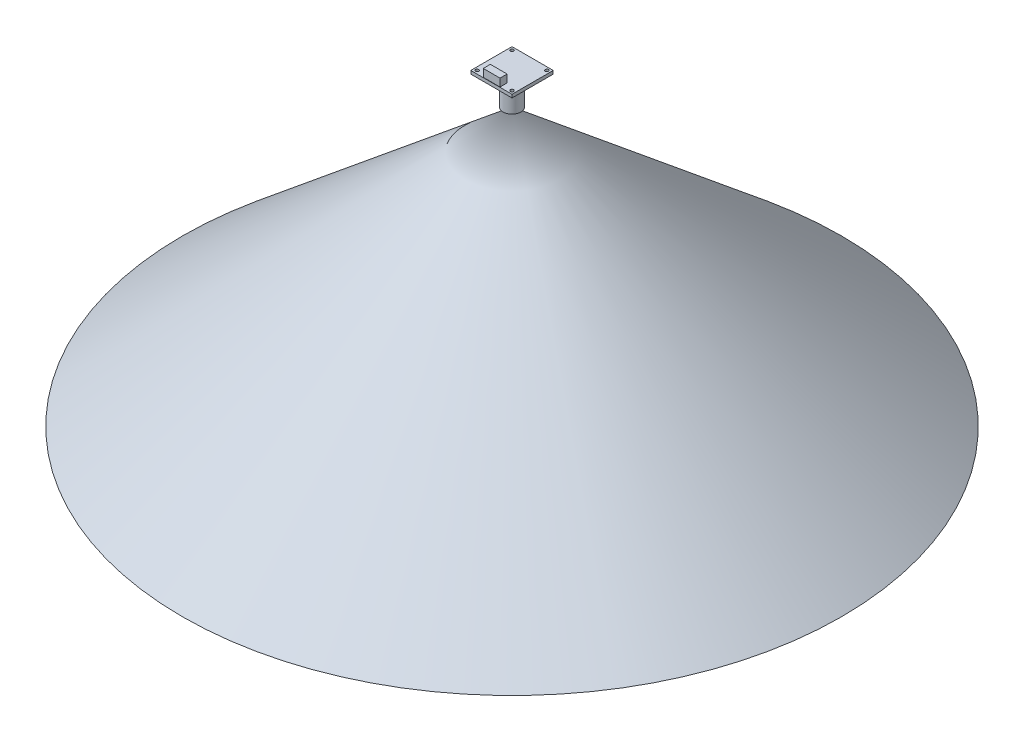
ISO-10303-21;
HEADER;
FILE_DESCRIPTION(('STEP AP214'),'2;1');
FILE_NAME('part.step','',(''),(''),'','','');
FILE_SCHEMA(('AUTOMOTIVE_DESIGN { 1 0 10303 214 1 1 1 1 }'));
ENDSEC;
DATA;
#1=APPLICATION_CONTEXT('core data for automotive mechanical design processes');
#2=APPLICATION_PROTOCOL_DEFINITION('international standard','automotive_design',2000,#1);
#3=PRODUCT_CONTEXT('',#1,'mechanical');
#4=PRODUCT('Part','Part','',(#3));
#5=PRODUCT_RELATED_PRODUCT_CATEGORY('part','',(#4));
#6=PRODUCT_DEFINITION_FORMATION('','',#4);
#7=PRODUCT_DEFINITION_CONTEXT('part definition',#1,'design');
#8=PRODUCT_DEFINITION('design','',#6,#7);
#9=PRODUCT_DEFINITION_SHAPE('','',#8);
#10=(LENGTH_UNIT() NAMED_UNIT(*) SI_UNIT(.MILLI.,.METRE.));
#11=(NAMED_UNIT(*) PLANE_ANGLE_UNIT() SI_UNIT($,.RADIAN.));
#12=(NAMED_UNIT(*) SI_UNIT($,.STERADIAN.) SOLID_ANGLE_UNIT());
#13=UNCERTAINTY_MEASURE_WITH_UNIT(LENGTH_MEASURE(1.E-05),#10,'distance_accuracy_value','');
#14=(GEOMETRIC_REPRESENTATION_CONTEXT(3) GLOBAL_UNCERTAINTY_ASSIGNED_CONTEXT((#13)) GLOBAL_UNIT_ASSIGNED_CONTEXT((#10,
#11,#12)) REPRESENTATION_CONTEXT('',''));
#15=CARTESIAN_POINT('',(0.,0.,0.));
#16=DIRECTION('',(0.,0.,1.));
#17=DIRECTION('',(1.,0.,0.));
#18=AXIS2_PLACEMENT_3D('',#15,#16,#17);
#19=CARTESIAN_POINT('',(0.,-236.641949206085,0.));
#20=DIRECTION('',(0.,1.,0.));
#21=DIRECTION('',(0.,0.,1.));
#22=AXIS2_PLACEMENT_3D('',#19,#20,#21);
#23=PLANE('',#22);
#24=CARTESIAN_POINT('',(0.,-236.641949206085,0.));
#25=DIRECTION('',(0.,1.,0.));
#26=DIRECTION('',(0.,0.,1.));
#27=AXIS2_PLACEMENT_3D('',#24,#25,#26);
#28=CIRCLE('',#27,255.800314087776);
#29=CARTESIAN_POINT('',(0.,-236.641949206085,255.800314087776));
#30=VERTEX_POINT('',#29);
#31=EDGE_CURVE('E12',#30,#30,#28,.T.);
#32=ORIENTED_EDGE('',*,*,#31,.F.);
#33=EDGE_LOOP('',(#32));
#34=FACE_BOUND('',#33,.T.);
#35=ADVANCED_FACE('F49',(#34),#23,.F.);
#36=CARTESIAN_POINT('',(0.,-236.641949206085,0.));
#37=DIRECTION('',(0.,-1.,0.));
#38=DIRECTION('',(0.,0.,-1.));
#39=AXIS2_PLACEMENT_3D('',#36,#37,#38);
#40=CONICAL_SURFACE('',#39,255.800314087776,0.872664625997167);
#41=CARTESIAN_POINT('',(0.,-22.,0.));
#42=VERTEX_POINT('',#41);
#43=VERTEX_LOOP('',#42);
#44=FACE_BOUND('',#43,.T.);
#45=ORIENTED_EDGE('',*,*,#31,.T.);
#46=EDGE_LOOP('',(#45));
#47=FACE_BOUND('',#46,.T.);
#48=ADVANCED_FACE('F56',(#44,#47),#40,.T.);
#49=CLOSED_SHELL('',(#35,#48));
#50=MANIFOLD_SOLID_BREP('B2_NOT_SHOWN',#49);
#51=CARTESIAN_POINT('',(0.,-22.,0.));
#52=DIRECTION('',(0.,1.,0.));
#53=DIRECTION('',(0.,0.,1.));
#54=AXIS2_PLACEMENT_3D('',#51,#52,#53);
#55=CYLINDRICAL_SURFACE('',#54,6.9);
#56=CARTESIAN_POINT('',(0.,-22.,0.));
#57=DIRECTION('',(0.,-1.,0.));
#58=DIRECTION('',(0.,0.,-1.));
#59=AXIS2_PLACEMENT_3D('',#56,#57,#58);
#60=CIRCLE('',#59,6.9);
#61=CARTESIAN_POINT('',(0.,-22.,-6.9));
#62=VERTEX_POINT('',#61);
#63=EDGE_CURVE('E48',#62,#62,#60,.T.);
#64=ORIENTED_EDGE('',*,*,#63,.F.);
#65=EDGE_LOOP('',(#64));
#66=FACE_BOUND('',#65,.T.);
#67=CARTESIAN_POINT('',(0.,0.,0.));
#68=DIRECTION('',(0.,-1.,0.));
#69=DIRECTION('',(0.,0.,-1.));
#70=AXIS2_PLACEMENT_3D('',#67,#68,#69);
#71=CIRCLE('',#70,6.9);
#72=CARTESIAN_POINT('',(0.,0.,-6.9));
#73=VERTEX_POINT('',#72);
#74=EDGE_CURVE('E89',#73,#73,#71,.T.);
#75=ORIENTED_EDGE('',*,*,#74,.T.);
#76=EDGE_LOOP('',(#75));
#77=FACE_BOUND('',#76,.T.);
#78=ADVANCED_FACE('F86',(#66,#77),#55,.T.);
#79=CARTESIAN_POINT('',(0.,-22.,0.));
#80=DIRECTION('',(0.,-1.,0.));
#81=DIRECTION('',(0.,0.,-1.));
#82=AXIS2_PLACEMENT_3D('',#79,#80,#81);
#83=PLANE('',#82);
#84=ORIENTED_EDGE('',*,*,#63,.T.);
#85=EDGE_LOOP('',(#84));
#86=FACE_BOUND('',#85,.T.);
#87=ADVANCED_FACE('F101',(#86),#83,.T.);
#88=CARTESIAN_POINT('',(0.,0.,0.));
#89=DIRECTION('',(0.,-1.,0.));
#90=DIRECTION('',(0.,0.,-1.));
#91=AXIS2_PLACEMENT_3D('',#88,#89,#90);
#92=PLANE('',#91);
#93=ORIENTED_EDGE('',*,*,#74,.F.);
#94=EDGE_LOOP('',(#93));
#95=FACE_BOUND('',#94,.T.);
#96=ADVANCED_FACE('F99',(#95),#92,.F.);
#97=CLOSED_SHELL('',(#78,#87,#96));
#98=MANIFOLD_SOLID_BREP('B6',#97);
#99=CARTESIAN_POINT('',(6.50000000000001,8.5,15.8));
#100=DIRECTION('',(-1.,0.,0.));
#101=DIRECTION('',(0.,0.,1.));
#102=AXIS2_PLACEMENT_3D('',#99,#100,#101);
#103=PLANE('',#102);
#104=DIRECTION('',(0.,0.,-1.));
#105=VECTOR('',#104,1.);
#106=CARTESIAN_POINT('',(6.50000000000001,2.5,15.8));
#107=LINE('',#106,#105);
#108=CARTESIAN_POINT('',(6.50000000000001,2.5,15.8));
#109=VERTEX_POINT('',#108);
#110=CARTESIAN_POINT('',(6.50000000000001,2.5,10.3));
#111=VERTEX_POINT('',#110);
#112=EDGE_CURVE('E198',#109,#111,#107,.T.);
#113=ORIENTED_EDGE('',*,*,#112,.T.);
#114=DIRECTION('',(0.,-1.,0.));
#115=VECTOR('',#114,1.);
#116=CARTESIAN_POINT('',(6.50000000000001,8.5,10.3));
#117=LINE('',#116,#115);
#118=CARTESIAN_POINT('',(6.50000000000001,8.5,10.3));
#119=VERTEX_POINT('',#118);
#120=EDGE_CURVE('E84',#119,#111,#117,.T.);
#121=ORIENTED_EDGE('',*,*,#120,.F.);
#122=DIRECTION('',(0.,0.,-1.));
#123=VECTOR('',#122,1.);
#124=CARTESIAN_POINT('',(6.50000000000001,8.5,15.8));
#125=LINE('',#124,#123);
#126=CARTESIAN_POINT('',(6.50000000000001,8.5,15.8));
#127=VERTEX_POINT('',#126);
#128=EDGE_CURVE('E186',#127,#119,#125,.T.);
#129=ORIENTED_EDGE('',*,*,#128,.F.);
#130=DIRECTION('',(0.,-1.,0.));
#131=VECTOR('',#130,1.);
#132=CARTESIAN_POINT('',(6.50000000000001,8.5,15.8));
#133=LINE('',#132,#131);
#134=EDGE_CURVE('E194',#127,#109,#133,.T.);
#135=ORIENTED_EDGE('',*,*,#134,.T.);
#136=EDGE_LOOP('',(#113,#121,#129,#135));
#137=FACE_BOUND('',#136,.T.);
#138=ADVANCED_FACE('F135',(#137),#103,.F.);
#139=CARTESIAN_POINT('',(-6.49999999999999,8.5,10.3));
#140=DIRECTION('',(0.,0.,1.));
#141=DIRECTION('',(1.,0.,0.));
#142=AXIS2_PLACEMENT_3D('',#139,#140,#141);
#143=PLANE('',#142);
#144=DIRECTION('',(-1.,0.,0.));
#145=VECTOR('',#144,1.);
#146=CARTESIAN_POINT('',(-6.49999999999999,2.5,10.3));
#147=LINE('',#146,#145);
#148=CARTESIAN_POINT('',(-6.49999999999999,2.5,10.3));
#149=VERTEX_POINT('',#148);
#150=EDGE_CURVE('E190',#111,#149,#147,.T.);
#151=ORIENTED_EDGE('',*,*,#150,.T.);
#152=DIRECTION('',(0.,-1.,0.));
#153=VECTOR('',#152,1.);
#154=CARTESIAN_POINT('',(-6.49999999999999,8.5,10.3));
#155=LINE('',#154,#153);
#156=CARTESIAN_POINT('',(-6.49999999999999,8.5,10.3));
#157=VERTEX_POINT('',#156);
#158=EDGE_CURVE('E143',#157,#149,#155,.T.);
#159=ORIENTED_EDGE('',*,*,#158,.F.);
#160=DIRECTION('',(-1.,0.,0.));
#161=VECTOR('',#160,1.);
#162=CARTESIAN_POINT('',(-6.49999999999999,8.5,10.3));
#163=LINE('',#162,#161);
#164=EDGE_CURVE('E181',#119,#157,#163,.T.);
#165=ORIENTED_EDGE('',*,*,#164,.F.);
#166=ORIENTED_EDGE('',*,*,#120,.T.);
#167=EDGE_LOOP('',(#151,#159,#165,#166));
#168=FACE_BOUND('',#167,.T.);
#169=ADVANCED_FACE('F189',(#168),#143,.F.);
#170=CARTESIAN_POINT('',(-6.49999999999999,8.5,15.8));
#171=DIRECTION('',(1.,0.,0.));
#172=DIRECTION('',(0.,0.,-1.));
#173=AXIS2_PLACEMENT_3D('',#170,#171,#172);
#174=PLANE('',#173);
#175=DIRECTION('',(0.,0.,1.));
#176=VECTOR('',#175,1.);
#177=CARTESIAN_POINT('',(-6.49999999999999,2.5,15.8));
#178=LINE('',#177,#176);
#179=CARTESIAN_POINT('',(-6.49999999999999,2.5,15.8));
#180=VERTEX_POINT('',#179);
#181=EDGE_CURVE('E168',#149,#180,#178,.T.);
#182=ORIENTED_EDGE('',*,*,#181,.T.);
#183=DIRECTION('',(0.,-1.,0.));
#184=VECTOR('',#183,1.);
#185=CARTESIAN_POINT('',(-6.49999999999999,8.5,15.8));
#186=LINE('',#185,#184);
#187=CARTESIAN_POINT('',(-6.49999999999999,8.5,15.8));
#188=VERTEX_POINT('',#187);
#189=EDGE_CURVE('E191',#188,#180,#186,.T.);
#190=ORIENTED_EDGE('',*,*,#189,.F.);
#191=DIRECTION('',(0.,0.,1.));
#192=VECTOR('',#191,1.);
#193=CARTESIAN_POINT('',(-6.49999999999999,8.5,15.8));
#194=LINE('',#193,#192);
#195=EDGE_CURVE('E184',#157,#188,#194,.T.);
#196=ORIENTED_EDGE('',*,*,#195,.F.);
#197=ORIENTED_EDGE('',*,*,#158,.T.);
#198=EDGE_LOOP('',(#182,#190,#196,#197));
#199=FACE_BOUND('',#198,.T.);
#200=ADVANCED_FACE('F192',(#199),#174,.F.);
#201=CARTESIAN_POINT('',(-6.49999999999999,8.5,15.8));
#202=DIRECTION('',(0.,0.,-1.));
#203=DIRECTION('',(-1.,0.,0.));
#204=AXIS2_PLACEMENT_3D('',#201,#202,#203);
#205=PLANE('',#204);
#206=DIRECTION('',(1.,0.,0.));
#207=VECTOR('',#206,1.);
#208=CARTESIAN_POINT('',(-6.49999999999999,2.5,15.8));
#209=LINE('',#208,#207);
#210=EDGE_CURVE('E174',#180,#109,#209,.T.);
#211=ORIENTED_EDGE('',*,*,#210,.T.);
#212=ORIENTED_EDGE('',*,*,#134,.F.);
#213=DIRECTION('',(1.,0.,0.));
#214=VECTOR('',#213,1.);
#215=CARTESIAN_POINT('',(-6.49999999999999,8.5,15.8));
#216=LINE('',#215,#214);
#217=EDGE_CURVE('E151',#188,#127,#216,.T.);
#218=ORIENTED_EDGE('',*,*,#217,.F.);
#219=ORIENTED_EDGE('',*,*,#189,.T.);
#220=EDGE_LOOP('',(#211,#212,#218,#219));
#221=FACE_BOUND('',#220,.T.);
#222=ADVANCED_FACE('F205',(#221),#205,.F.);
#223=CARTESIAN_POINT('',(0.,8.5,0.));
#224=DIRECTION('',(0.,-1.,0.));
#225=DIRECTION('',(0.,0.,-1.));
#226=AXIS2_PLACEMENT_3D('',#223,#224,#225);
#227=PLANE('',#226);
#228=ORIENTED_EDGE('',*,*,#128,.T.);
#229=ORIENTED_EDGE('',*,*,#164,.T.);
#230=ORIENTED_EDGE('',*,*,#195,.T.);
#231=ORIENTED_EDGE('',*,*,#217,.T.);
#232=EDGE_LOOP('',(#228,#229,#230,#231));
#233=FACE_BOUND('',#232,.T.);
#234=ADVANCED_FACE('F182',(#233),#227,.F.);
#235=CARTESIAN_POINT('',(0.,2.5,0.));
#236=DIRECTION('',(0.,-1.,0.));
#237=DIRECTION('',(0.,0.,-1.));
#238=AXIS2_PLACEMENT_3D('',#235,#236,#237);
#239=PLANE('',#238);
#240=ORIENTED_EDGE('',*,*,#112,.F.);
#241=ORIENTED_EDGE('',*,*,#210,.F.);
#242=ORIENTED_EDGE('',*,*,#181,.F.);
#243=ORIENTED_EDGE('',*,*,#150,.F.);
#244=EDGE_LOOP('',(#240,#241,#242,#243));
#245=FACE_BOUND('',#244,.T.);
#246=ADVANCED_FACE('F208',(#245),#239,.T.);
#247=CLOSED_SHELL('',(#138,#169,#200,#222,#234,#246));
#248=MANIFOLD_SOLID_BREP('B43',#247);
#249=CARTESIAN_POINT('',(0.,2.5,0.));
#250=DIRECTION('',(0.,1.,0.));
#251=DIRECTION('',(0.,0.,1.));
#252=AXIS2_PLACEMENT_3D('',#249,#250,#251);
#253=PLANE('',#252);
#254=CARTESIAN_POINT('',(13.5,2.5,13.5));
#255=DIRECTION('',(0.,1.,0.));
#256=DIRECTION('',(0.,0.,1.));
#257=AXIS2_PLACEMENT_3D('',#254,#255,#256);
#258=CIRCLE('',#257,1.25);
#259=CARTESIAN_POINT('',(13.5,2.5,14.75));
#260=VERTEX_POINT('',#259);
#261=EDGE_CURVE('E346',#260,#260,#258,.T.);
#262=ORIENTED_EDGE('',*,*,#261,.F.);
#263=EDGE_LOOP('',(#262));
#264=FACE_BOUND('',#263,.T.);
#265=CARTESIAN_POINT('',(-13.5,2.5,-13.5));
#266=DIRECTION('',(0.,1.,0.));
#267=DIRECTION('',(0.,0.,1.));
#268=AXIS2_PLACEMENT_3D('',#265,#266,#267);
#269=CIRCLE('',#268,1.25);
#270=CARTESIAN_POINT('',(-13.5,2.5,-12.25));
#271=VERTEX_POINT('',#270);
#272=EDGE_CURVE('E325',#271,#271,#269,.T.);
#273=ORIENTED_EDGE('',*,*,#272,.F.);
#274=EDGE_LOOP('',(#273));
#275=FACE_BOUND('',#274,.T.);
#276=DIRECTION('',(0.,0.,-1.));
#277=VECTOR('',#276,1.);
#278=CARTESIAN_POINT('',(16.,2.5,-16.));
#279=LINE('',#278,#277);
#280=CARTESIAN_POINT('',(16.,2.5,16.));
#281=VERTEX_POINT('',#280);
#282=CARTESIAN_POINT('',(16.,2.5,-16.));
#283=VERTEX_POINT('',#282);
#284=EDGE_CURVE('E310',#281,#283,#279,.T.);
#285=ORIENTED_EDGE('',*,*,#284,.T.);
#286=DIRECTION('',(-1.,0.,0.));
#287=VECTOR('',#286,1.);
#288=CARTESIAN_POINT('',(-16.,2.5,-16.));
#289=LINE('',#288,#287);
#290=CARTESIAN_POINT('',(-16.,2.5,-16.));
#291=VERTEX_POINT('',#290);
#292=EDGE_CURVE('E305',#283,#291,#289,.T.);
#293=ORIENTED_EDGE('',*,*,#292,.T.);
#294=DIRECTION('',(0.,0.,1.));
#295=VECTOR('',#294,1.);
#296=CARTESIAN_POINT('',(-16.,2.5,-16.));
#297=LINE('',#296,#295);
#298=CARTESIAN_POINT('',(-16.,2.5,16.));
#299=VERTEX_POINT('',#298);
#300=EDGE_CURVE('E308',#291,#299,#297,.T.);
#301=ORIENTED_EDGE('',*,*,#300,.T.);
#302=DIRECTION('',(1.,0.,0.));
#303=VECTOR('',#302,1.);
#304=CARTESIAN_POINT('',(-16.,2.5,16.));
#305=LINE('',#304,#303);
#306=EDGE_CURVE('E275',#299,#281,#305,.T.);
#307=ORIENTED_EDGE('',*,*,#306,.T.);
#308=EDGE_LOOP('',(#285,#293,#301,#307));
#309=FACE_BOUND('',#308,.T.);
#310=CARTESIAN_POINT('',(13.5,2.5,-13.5));
#311=DIRECTION('',(0.,1.,0.));
#312=DIRECTION('',(0.,0.,-1.));
#313=AXIS2_PLACEMENT_3D('',#310,#311,#312);
#314=CIRCLE('',#313,1.25);
#315=CARTESIAN_POINT('',(13.5,2.5,-14.75));
#316=VERTEX_POINT('',#315);
#317=EDGE_CURVE('E340',#316,#316,#314,.T.);
#318=ORIENTED_EDGE('',*,*,#317,.F.);
#319=EDGE_LOOP('',(#318));
#320=FACE_BOUND('',#319,.T.);
#321=CARTESIAN_POINT('',(-13.5,2.5,13.5));
#322=DIRECTION('',(0.,1.,0.));
#323=DIRECTION('',(0.,0.,-1.));
#324=AXIS2_PLACEMENT_3D('',#321,#322,#323);
#325=CIRCLE('',#324,1.25);
#326=CARTESIAN_POINT('',(-13.5,2.5,12.25));
#327=VERTEX_POINT('',#326);
#328=EDGE_CURVE('E352',#327,#327,#325,.T.);
#329=ORIENTED_EDGE('',*,*,#328,.F.);
#330=EDGE_LOOP('',(#329));
#331=FACE_BOUND('',#330,.T.);
#332=ADVANCED_FACE('F258',(#264,#275,#309,#320,#331),#253,.T.);
#333=CARTESIAN_POINT('',(0.,0.,0.));
#334=DIRECTION('',(0.,1.,0.));
#335=DIRECTION('',(0.,0.,1.));
#336=AXIS2_PLACEMENT_3D('',#333,#334,#335);
#337=PLANE('',#336);
#338=DIRECTION('',(0.,0.,-1.));
#339=VECTOR('',#338,1.);
#340=CARTESIAN_POINT('',(16.,0.,-16.));
#341=LINE('',#340,#339);
#342=CARTESIAN_POINT('',(16.,0.,16.));
#343=VERTEX_POINT('',#342);
#344=CARTESIAN_POINT('',(16.,0.,-16.));
#345=VERTEX_POINT('',#344);
#346=EDGE_CURVE('E322',#343,#345,#341,.T.);
#347=ORIENTED_EDGE('',*,*,#346,.F.);
#348=DIRECTION('',(1.,0.,0.));
#349=VECTOR('',#348,1.);
#350=CARTESIAN_POINT('',(-16.,0.,16.));
#351=LINE('',#350,#349);
#352=CARTESIAN_POINT('',(-16.,0.,16.));
#353=VERTEX_POINT('',#352);
#354=EDGE_CURVE('E298',#353,#343,#351,.T.);
#355=ORIENTED_EDGE('',*,*,#354,.F.);
#356=DIRECTION('',(0.,0.,1.));
#357=VECTOR('',#356,1.);
#358=CARTESIAN_POINT('',(-16.,0.,-16.));
#359=LINE('',#358,#357);
#360=CARTESIAN_POINT('',(-16.,0.,-16.));
#361=VERTEX_POINT('',#360);
#362=EDGE_CURVE('E292',#361,#353,#359,.T.);
#363=ORIENTED_EDGE('',*,*,#362,.F.);
#364=DIRECTION('',(-1.,0.,0.));
#365=VECTOR('',#364,1.);
#366=CARTESIAN_POINT('',(-16.,0.,-16.));
#367=LINE('',#366,#365);
#368=EDGE_CURVE('E314',#345,#361,#367,.T.);
#369=ORIENTED_EDGE('',*,*,#368,.F.);
#370=EDGE_LOOP('',(#347,#355,#363,#369));
#371=FACE_BOUND('',#370,.T.);
#372=CARTESIAN_POINT('',(-13.5,0.,-13.5));
#373=DIRECTION('',(0.,1.,0.));
#374=DIRECTION('',(0.,0.,1.));
#375=AXIS2_PLACEMENT_3D('',#372,#373,#374);
#376=CIRCLE('',#375,1.25);
#377=CARTESIAN_POINT('',(-13.5,0.,-12.25));
#378=VERTEX_POINT('',#377);
#379=EDGE_CURVE('E337',#378,#378,#376,.T.);
#380=ORIENTED_EDGE('',*,*,#379,.T.);
#381=EDGE_LOOP('',(#380));
#382=FACE_BOUND('',#381,.T.);
#383=CARTESIAN_POINT('',(13.5,0.,-13.5));
#384=DIRECTION('',(0.,1.,0.));
#385=DIRECTION('',(0.,0.,-1.));
#386=AXIS2_PLACEMENT_3D('',#383,#384,#385);
#387=CIRCLE('',#386,1.25);
#388=CARTESIAN_POINT('',(13.5,0.,-14.75));
#389=VERTEX_POINT('',#388);
#390=EDGE_CURVE('E343',#389,#389,#387,.T.);
#391=ORIENTED_EDGE('',*,*,#390,.T.);
#392=EDGE_LOOP('',(#391));
#393=FACE_BOUND('',#392,.T.);
#394=CARTESIAN_POINT('',(13.5,0.,13.5));
#395=DIRECTION('',(0.,1.,0.));
#396=DIRECTION('',(0.,0.,1.));
#397=AXIS2_PLACEMENT_3D('',#394,#395,#396);
#398=CIRCLE('',#397,1.25);
#399=CARTESIAN_POINT('',(13.5,0.,14.75));
#400=VERTEX_POINT('',#399);
#401=EDGE_CURVE('E349',#400,#400,#398,.T.);
#402=ORIENTED_EDGE('',*,*,#401,.T.);
#403=EDGE_LOOP('',(#402));
#404=FACE_BOUND('',#403,.T.);
#405=CARTESIAN_POINT('',(-13.5,0.,13.5));
#406=DIRECTION('',(0.,1.,0.));
#407=DIRECTION('',(0.,0.,-1.));
#408=AXIS2_PLACEMENT_3D('',#405,#406,#407);
#409=CIRCLE('',#408,1.25);
#410=CARTESIAN_POINT('',(-13.5,0.,12.25));
#411=VERTEX_POINT('',#410);
#412=EDGE_CURVE('E355',#411,#411,#409,.T.);
#413=ORIENTED_EDGE('',*,*,#412,.T.);
#414=EDGE_LOOP('',(#413));
#415=FACE_BOUND('',#414,.T.);
#416=ADVANCED_FACE('F333',(#371,#382,#393,#404,#415),#337,.F.);
#417=CARTESIAN_POINT('',(16.,2.5,-16.));
#418=DIRECTION('',(-1.,0.,0.));
#419=DIRECTION('',(0.,0.,1.));
#420=AXIS2_PLACEMENT_3D('',#417,#418,#419);
#421=PLANE('',#420);
#422=ORIENTED_EDGE('',*,*,#346,.T.);
#423=DIRECTION('',(0.,-1.,0.));
#424=VECTOR('',#423,1.);
#425=CARTESIAN_POINT('',(16.,2.5,-16.));
#426=LINE('',#425,#424);
#427=EDGE_CURVE('E133',#283,#345,#426,.T.);
#428=ORIENTED_EDGE('',*,*,#427,.F.);
#429=ORIENTED_EDGE('',*,*,#284,.F.);
#430=DIRECTION('',(0.,-1.,0.));
#431=VECTOR('',#430,1.);
#432=CARTESIAN_POINT('',(16.,2.5,16.));
#433=LINE('',#432,#431);
#434=EDGE_CURVE('E318',#281,#343,#433,.T.);
#435=ORIENTED_EDGE('',*,*,#434,.T.);
#436=EDGE_LOOP('',(#422,#428,#429,#435));
#437=FACE_BOUND('',#436,.T.);
#438=ADVANCED_FACE('F260',(#437),#421,.F.);
#439=CARTESIAN_POINT('',(-16.,2.5,-16.));
#440=DIRECTION('',(0.,0.,1.));
#441=DIRECTION('',(1.,0.,0.));
#442=AXIS2_PLACEMENT_3D('',#439,#440,#441);
#443=PLANE('',#442);
#444=ORIENTED_EDGE('',*,*,#368,.T.);
#445=DIRECTION('',(0.,-1.,0.));
#446=VECTOR('',#445,1.);
#447=CARTESIAN_POINT('',(-16.,2.5,-16.));
#448=LINE('',#447,#446);
#449=EDGE_CURVE('E267',#291,#361,#448,.T.);
#450=ORIENTED_EDGE('',*,*,#449,.F.);
#451=ORIENTED_EDGE('',*,*,#292,.F.);
#452=ORIENTED_EDGE('',*,*,#427,.T.);
#453=EDGE_LOOP('',(#444,#450,#451,#452));
#454=FACE_BOUND('',#453,.T.);
#455=ADVANCED_FACE('F313',(#454),#443,.F.);
#456=CARTESIAN_POINT('',(-16.,2.5,-16.));
#457=DIRECTION('',(1.,0.,0.));
#458=DIRECTION('',(0.,0.,-1.));
#459=AXIS2_PLACEMENT_3D('',#456,#457,#458);
#460=PLANE('',#459);
#461=ORIENTED_EDGE('',*,*,#362,.T.);
#462=DIRECTION('',(0.,-1.,0.));
#463=VECTOR('',#462,1.);
#464=CARTESIAN_POINT('',(-16.,2.5,16.));
#465=LINE('',#464,#463);
#466=EDGE_CURVE('E315',#299,#353,#465,.T.);
#467=ORIENTED_EDGE('',*,*,#466,.F.);
#468=ORIENTED_EDGE('',*,*,#300,.F.);
#469=ORIENTED_EDGE('',*,*,#449,.T.);
#470=EDGE_LOOP('',(#461,#467,#468,#469));
#471=FACE_BOUND('',#470,.T.);
#472=ADVANCED_FACE('F316',(#471),#460,.F.);
#473=CARTESIAN_POINT('',(-16.,2.5,16.));
#474=DIRECTION('',(0.,0.,-1.));
#475=DIRECTION('',(-1.,0.,0.));
#476=AXIS2_PLACEMENT_3D('',#473,#474,#475);
#477=PLANE('',#476);
#478=ORIENTED_EDGE('',*,*,#354,.T.);
#479=ORIENTED_EDGE('',*,*,#434,.F.);
#480=ORIENTED_EDGE('',*,*,#306,.F.);
#481=ORIENTED_EDGE('',*,*,#466,.T.);
#482=EDGE_LOOP('',(#478,#479,#480,#481));
#483=FACE_BOUND('',#482,.T.);
#484=ADVANCED_FACE('F330',(#483),#477,.F.);
#485=CARTESIAN_POINT('',(-13.5,2.5,-13.5));
#486=DIRECTION('',(0.,-1.,0.));
#487=DIRECTION('',(0.,0.,-1.));
#488=AXIS2_PLACEMENT_3D('',#485,#486,#487);
#489=CYLINDRICAL_SURFACE('',#488,1.25);
#490=ORIENTED_EDGE('',*,*,#272,.T.);
#491=EDGE_LOOP('',(#490));
#492=FACE_BOUND('',#491,.T.);
#493=ORIENTED_EDGE('',*,*,#379,.F.);
#494=EDGE_LOOP('',(#493));
#495=FACE_BOUND('',#494,.T.);
#496=ADVANCED_FACE('F374',(#492,#495),#489,.F.);
#497=CARTESIAN_POINT('',(13.5,2.5,-13.5));
#498=DIRECTION('',(0.,-1.,0.));
#499=DIRECTION('',(0.,0.,-1.));
#500=AXIS2_PLACEMENT_3D('',#497,#498,#499);
#501=CYLINDRICAL_SURFACE('',#500,1.25);
#502=ORIENTED_EDGE('',*,*,#317,.T.);
#503=EDGE_LOOP('',(#502));
#504=FACE_BOUND('',#503,.T.);
#505=ORIENTED_EDGE('',*,*,#390,.F.);
#506=EDGE_LOOP('',(#505));
#507=FACE_BOUND('',#506,.T.);
#508=ADVANCED_FACE('F420',(#504,#507),#501,.F.);
#509=CARTESIAN_POINT('',(13.5,2.5,13.5));
#510=DIRECTION('',(0.,-1.,0.));
#511=DIRECTION('',(0.,0.,-1.));
#512=AXIS2_PLACEMENT_3D('',#509,#510,#511);
#513=CYLINDRICAL_SURFACE('',#512,1.25);
#514=ORIENTED_EDGE('',*,*,#261,.T.);
#515=EDGE_LOOP('',(#514));
#516=FACE_BOUND('',#515,.T.);
#517=ORIENTED_EDGE('',*,*,#401,.F.);
#518=EDGE_LOOP('',(#517));
#519=FACE_BOUND('',#518,.T.);
#520=ADVANCED_FACE('F428',(#516,#519),#513,.F.);
#521=CARTESIAN_POINT('',(-13.5,2.5,13.5));
#522=DIRECTION('',(0.,-1.,0.));
#523=DIRECTION('',(0.,0.,-1.));
#524=AXIS2_PLACEMENT_3D('',#521,#522,#523);
#525=CYLINDRICAL_SURFACE('',#524,1.25);
#526=ORIENTED_EDGE('',*,*,#328,.T.);
#527=EDGE_LOOP('',(#526));
#528=FACE_BOUND('',#527,.T.);
#529=ORIENTED_EDGE('',*,*,#412,.F.);
#530=EDGE_LOOP('',(#529));
#531=FACE_BOUND('',#530,.T.);
#532=ADVANCED_FACE('F361',(#528,#531),#525,.F.);
#533=CLOSED_SHELL('',(#332,#416,#438,#455,#472,#484,#496,#508,#520,#532));
#534=MANIFOLD_SOLID_BREP('B78',#533);
#535=ADVANCED_BREP_SHAPE_REPRESENTATION('',(#18,#50,#98,#248,#534),#14);
#536=SHAPE_DEFINITION_REPRESENTATION(#9,#535);
ENDSEC;
END-ISO-10303-21;
